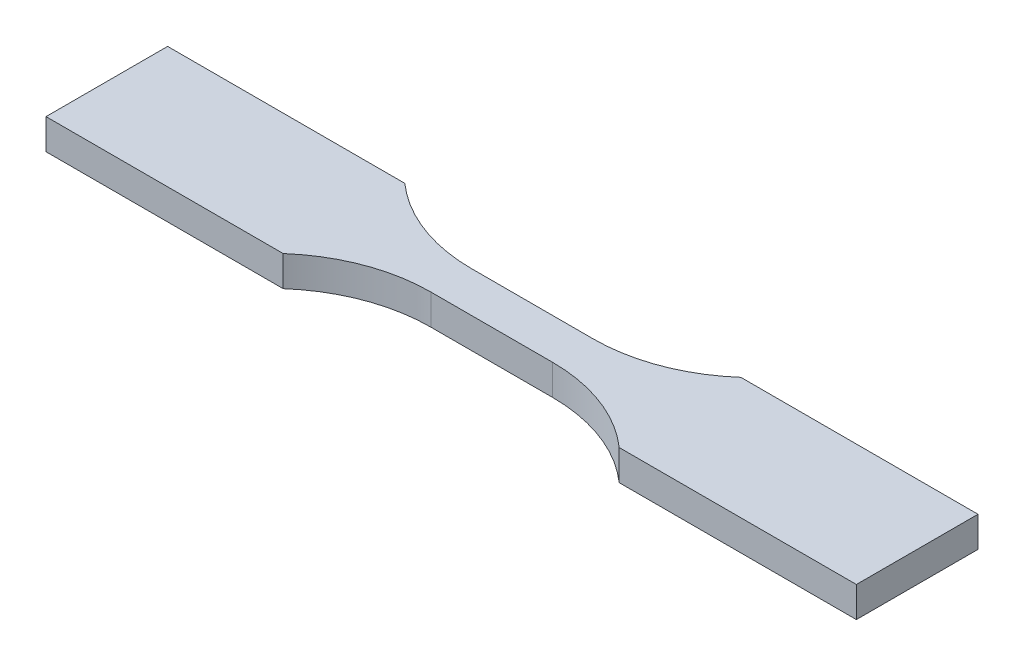
ISO-10303-21;
HEADER;
FILE_DESCRIPTION(('STEP AP214'),'2;1');
FILE_NAME('part.step','',(''),(''),'','','');
FILE_SCHEMA(('AUTOMOTIVE_DESIGN { 1 0 10303 214 1 1 1 1 }'));
ENDSEC;
DATA;
#1=APPLICATION_CONTEXT('core data for automotive mechanical design processes');
#2=APPLICATION_PROTOCOL_DEFINITION('international standard','automotive_design',2000,#1);
#3=PRODUCT_CONTEXT('',#1,'mechanical');
#4=PRODUCT('Part','Part','',(#3));
#5=PRODUCT_RELATED_PRODUCT_CATEGORY('part','',(#4));
#6=PRODUCT_DEFINITION_FORMATION('','',#4);
#7=PRODUCT_DEFINITION_CONTEXT('part definition',#1,'design');
#8=PRODUCT_DEFINITION('design','',#6,#7);
#9=PRODUCT_DEFINITION_SHAPE('','',#8);
#10=(LENGTH_UNIT() NAMED_UNIT(*) SI_UNIT(.MILLI.,.METRE.));
#11=(NAMED_UNIT(*) PLANE_ANGLE_UNIT() SI_UNIT($,.RADIAN.));
#12=(NAMED_UNIT(*) SI_UNIT($,.STERADIAN.) SOLID_ANGLE_UNIT());
#13=UNCERTAINTY_MEASURE_WITH_UNIT(LENGTH_MEASURE(1.E-05),#10,'distance_accuracy_value','');
#14=(GEOMETRIC_REPRESENTATION_CONTEXT(3) GLOBAL_UNCERTAINTY_ASSIGNED_CONTEXT((#13)) GLOBAL_UNIT_ASSIGNED_CONTEXT((#10,
#11,#12)) REPRESENTATION_CONTEXT('',''));
#15=CARTESIAN_POINT('',(0.,0.,0.));
#16=DIRECTION('',(0.,0.,1.));
#17=DIRECTION('',(1.,0.,0.));
#18=AXIS2_PLACEMENT_3D('',#15,#16,#17);
#19=CARTESIAN_POINT('',(9.9822,1.567422,0.));
#20=DIRECTION('',(-1.,0.,0.));
#21=DIRECTION('',(0.,0.,1.));
#22=AXIS2_PLACEMENT_3D('',#19,#20,#21);
#23=PLANE('',#22);
#24=DIRECTION('',(0.,0.,-1.));
#25=VECTOR('',#24,1.);
#26=CARTESIAN_POINT('',(9.9822,0.817578,0.));
#27=LINE('',#26,#25);
#28=CARTESIAN_POINT('',(9.9822,0.817578,1.498116));
#29=VERTEX_POINT('',#28);
#30=CARTESIAN_POINT('',(9.9822,0.817578,-1.498116));
#31=VERTEX_POINT('',#30);
#32=EDGE_CURVE('E212',#29,#31,#27,.T.);
#33=ORIENTED_EDGE('',*,*,#32,.T.);
#34=DIRECTION('',(0.,-1.,0.));
#35=VECTOR('',#34,1.);
#36=CARTESIAN_POINT('',(9.9822,1.567422,-1.498116));
#37=LINE('',#36,#35);
#38=CARTESIAN_POINT('',(9.9822,1.567422,-1.498116));
#39=VERTEX_POINT('',#38);
#40=EDGE_CURVE('E11',#39,#31,#37,.T.);
#41=ORIENTED_EDGE('',*,*,#40,.F.);
#42=DIRECTION('',(0.,0.,-1.));
#43=VECTOR('',#42,1.);
#44=CARTESIAN_POINT('',(9.9822,1.567422,0.));
#45=LINE('',#44,#43);
#46=CARTESIAN_POINT('',(9.9822,1.567422,1.498116));
#47=VERTEX_POINT('',#46);
#48=EDGE_CURVE('E79',#47,#39,#45,.T.);
#49=ORIENTED_EDGE('',*,*,#48,.F.);
#50=DIRECTION('',(0.,-1.,0.));
#51=VECTOR('',#50,1.);
#52=CARTESIAN_POINT('',(9.9822,1.567422,1.498116));
#53=LINE('',#52,#51);
#54=EDGE_CURVE('E199',#47,#29,#53,.T.);
#55=ORIENTED_EDGE('',*,*,#54,.T.);
#56=EDGE_LOOP('',(#33,#41,#49,#55));
#57=FACE_BOUND('',#56,.T.);
#58=ADVANCED_FACE('F39',(#57),#23,.F.);
#59=CARTESIAN_POINT('',(4.1391578737309,1.567422,-1.498116));
#60=DIRECTION('',(0.,0.,1.));
#61=DIRECTION('',(1.,0.,0.));
#62=AXIS2_PLACEMENT_3D('',#59,#60,#61);
#63=PLANE('',#62);
#64=DIRECTION('',(-1.,0.,0.));
#65=VECTOR('',#64,1.);
#66=CARTESIAN_POINT('',(4.1391578737309,0.817578,-1.498116));
#67=LINE('',#66,#65);
#68=CARTESIAN_POINT('',(4.1391578737309,0.817578,-1.498116));
#69=VERTEX_POINT('',#68);
#70=EDGE_CURVE('E69',#31,#69,#67,.T.);
#71=ORIENTED_EDGE('',*,*,#70,.T.);
#72=DIRECTION('',(0.,-1.,0.));
#73=VECTOR('',#72,1.);
#74=CARTESIAN_POINT('',(4.1391578737309,1.567422,-1.498116));
#75=LINE('',#74,#73);
#76=CARTESIAN_POINT('',(4.1391578737309,1.567422,-1.498116));
#77=VERTEX_POINT('',#76);
#78=EDGE_CURVE('E47',#77,#69,#75,.T.);
#79=ORIENTED_EDGE('',*,*,#78,.F.);
#80=DIRECTION('',(-1.,0.,0.));
#81=VECTOR('',#80,1.);
#82=CARTESIAN_POINT('',(4.1391578737309,1.567422,-1.498116));
#83=LINE('',#82,#81);
#84=EDGE_CURVE('E214',#39,#77,#83,.T.);
#85=ORIENTED_EDGE('',*,*,#84,.F.);
#86=ORIENTED_EDGE('',*,*,#40,.T.);
#87=EDGE_LOOP('',(#71,#79,#85,#86));
#88=FACE_BOUND('',#87,.T.);
#89=ADVANCED_FACE('F256',(#88),#63,.F.);
#90=CARTESIAN_POINT('',(1.498116,1.567422,-4.492776));
#91=DIRECTION('',(0.,-1.,0.));
#92=DIRECTION('',(0.,0.,-1.));
#93=AXIS2_PLACEMENT_3D('',#90,#91,#92);
#94=CYLINDRICAL_SURFACE('',#93,3.99288);
#95=CARTESIAN_POINT('',(1.498116,0.817578,-4.492776));
#96=DIRECTION('',(0.,-1.,0.));
#97=DIRECTION('',(0.,0.,1.));
#98=AXIS2_PLACEMENT_3D('',#95,#96,#97);
#99=CIRCLE('',#98,3.99288);
#100=CARTESIAN_POINT('',(1.498116,0.817578,-0.499896));
#101=VERTEX_POINT('',#100);
#102=EDGE_CURVE('E74',#69,#101,#99,.T.);
#103=ORIENTED_EDGE('',*,*,#102,.T.);
#104=DIRECTION('',(0.,-1.,0.));
#105=VECTOR('',#104,1.);
#106=CARTESIAN_POINT('',(1.498116,1.567422,-0.499896));
#107=LINE('',#106,#105);
#108=CARTESIAN_POINT('',(1.498116,1.567422,-0.499896));
#109=VERTEX_POINT('',#108);
#110=EDGE_CURVE('E220',#109,#101,#107,.T.);
#111=ORIENTED_EDGE('',*,*,#110,.F.);
#112=CARTESIAN_POINT('',(1.498116,1.567422,-4.492776));
#113=DIRECTION('',(0.,-1.,0.));
#114=DIRECTION('',(0.,0.,1.));
#115=AXIS2_PLACEMENT_3D('',#112,#113,#114);
#116=CIRCLE('',#115,3.99288);
#117=EDGE_CURVE('E55',#77,#109,#116,.T.);
#118=ORIENTED_EDGE('',*,*,#117,.F.);
#119=ORIENTED_EDGE('',*,*,#78,.T.);
#120=EDGE_LOOP('',(#103,#111,#118,#119));
#121=FACE_BOUND('',#120,.T.);
#122=ADVANCED_FACE('F225',(#121),#94,.F.);
#123=CARTESIAN_POINT('',(0.,1.567422,-0.499896));
#124=DIRECTION('',(0.,0.,1.));
#125=DIRECTION('',(1.,0.,0.));
#126=AXIS2_PLACEMENT_3D('',#123,#124,#125);
#127=PLANE('',#126);
#128=DIRECTION('',(-1.,0.,0.));
#129=VECTOR('',#128,1.);
#130=CARTESIAN_POINT('',(0.,0.817578,-0.499896));
#131=LINE('',#130,#129);
#132=CARTESIAN_POINT('',(-1.498116,0.817578,-0.499896));
#133=VERTEX_POINT('',#132);
#134=EDGE_CURVE('E215',#101,#133,#131,.T.);
#135=ORIENTED_EDGE('',*,*,#134,.T.);
#136=DIRECTION('',(0.,-1.,0.));
#137=VECTOR('',#136,1.);
#138=CARTESIAN_POINT('',(-1.498116,1.567422,-0.499896));
#139=LINE('',#138,#137);
#140=CARTESIAN_POINT('',(-1.498116,1.567422,-0.499896));
#141=VERTEX_POINT('',#140);
#142=EDGE_CURVE('E186',#141,#133,#139,.T.);
#143=ORIENTED_EDGE('',*,*,#142,.F.);
#144=DIRECTION('',(-1.,0.,0.));
#145=VECTOR('',#144,1.);
#146=CARTESIAN_POINT('',(0.,1.567422,-0.499896));
#147=LINE('',#146,#145);
#148=EDGE_CURVE('E218',#109,#141,#147,.T.);
#149=ORIENTED_EDGE('',*,*,#148,.F.);
#150=ORIENTED_EDGE('',*,*,#110,.T.);
#151=EDGE_LOOP('',(#135,#143,#149,#150));
#152=FACE_BOUND('',#151,.T.);
#153=ADVANCED_FACE('F233',(#152),#127,.F.);
#154=CARTESIAN_POINT('',(1.498116,1.567422,-4.492776));
#155=DIRECTION('',(0.,1.,0.));
#156=DIRECTION('',(0.,0.,1.));
#157=AXIS2_PLACEMENT_3D('',#154,#155,#156);
#158=PLANE('',#157);
#159=CARTESIAN_POINT('',(-1.498116,1.567422,4.492776));
#160=DIRECTION('',(0.,-1.,0.));
#161=DIRECTION('',(0.,0.,-1.));
#162=AXIS2_PLACEMENT_3D('',#159,#160,#161);
#163=CIRCLE('',#162,3.99288);
#164=CARTESIAN_POINT('',(-4.1391578737309,1.567422,1.498116));
#165=VERTEX_POINT('',#164);
#166=CARTESIAN_POINT('',(-1.498116,1.567422,0.499896));
#167=VERTEX_POINT('',#166);
#168=EDGE_CURVE('E160',#165,#167,#163,.T.);
#169=ORIENTED_EDGE('',*,*,#168,.T.);
#170=DIRECTION('',(-1.,0.,0.));
#171=VECTOR('',#170,1.);
#172=CARTESIAN_POINT('',(0.,1.567422,0.499896));
#173=LINE('',#172,#171);
#174=CARTESIAN_POINT('',(1.498116,1.567422,0.499896));
#175=VERTEX_POINT('',#174);
#176=EDGE_CURVE('E190',#175,#167,#173,.T.);
#177=ORIENTED_EDGE('',*,*,#176,.F.);
#178=CARTESIAN_POINT('',(1.498116,1.567422,4.492776));
#179=DIRECTION('',(0.,1.,0.));
#180=DIRECTION('',(0.,0.,-1.));
#181=AXIS2_PLACEMENT_3D('',#178,#179,#180);
#182=CIRCLE('',#181,3.99288);
#183=CARTESIAN_POINT('',(4.1391578737309,1.567422,1.498116));
#184=VERTEX_POINT('',#183);
#185=EDGE_CURVE('E192',#184,#175,#182,.T.);
#186=ORIENTED_EDGE('',*,*,#185,.F.);
#187=DIRECTION('',(-1.,0.,0.));
#188=VECTOR('',#187,1.);
#189=CARTESIAN_POINT('',(4.1391578737309,1.567422,1.498116));
#190=LINE('',#189,#188);
#191=EDGE_CURVE('E196',#47,#184,#190,.T.);
#192=ORIENTED_EDGE('',*,*,#191,.F.);
#193=ORIENTED_EDGE('',*,*,#48,.T.);
#194=ORIENTED_EDGE('',*,*,#84,.T.);
#195=ORIENTED_EDGE('',*,*,#117,.T.);
#196=ORIENTED_EDGE('',*,*,#148,.T.);
#197=CARTESIAN_POINT('',(-1.498116,1.567422,-4.492776));
#198=DIRECTION('',(0.,1.,0.));
#199=DIRECTION('',(0.,0.,1.));
#200=AXIS2_PLACEMENT_3D('',#197,#198,#199);
#201=CIRCLE('',#200,3.99288);
#202=CARTESIAN_POINT('',(-4.1391578737309,1.567422,-1.498116));
#203=VERTEX_POINT('',#202);
#204=EDGE_CURVE('E173',#203,#141,#201,.T.);
#205=ORIENTED_EDGE('',*,*,#204,.F.);
#206=DIRECTION('',(1.,0.,0.));
#207=VECTOR('',#206,1.);
#208=CARTESIAN_POINT('',(-4.1391578737309,1.567422,-1.498116));
#209=LINE('',#208,#207);
#210=CARTESIAN_POINT('',(-9.9822,1.567422,-1.498116));
#211=VERTEX_POINT('',#210);
#212=EDGE_CURVE('E143',#211,#203,#209,.T.);
#213=ORIENTED_EDGE('',*,*,#212,.F.);
#214=DIRECTION('',(0.,0.,-1.));
#215=VECTOR('',#214,1.);
#216=CARTESIAN_POINT('',(-9.9822,1.567422,0.));
#217=LINE('',#216,#215);
#218=CARTESIAN_POINT('',(-9.9822,1.567422,1.498116));
#219=VERTEX_POINT('',#218);
#220=EDGE_CURVE('E134',#219,#211,#217,.T.);
#221=ORIENTED_EDGE('',*,*,#220,.F.);
#222=DIRECTION('',(1.,0.,0.));
#223=VECTOR('',#222,1.);
#224=CARTESIAN_POINT('',(-4.1391578737309,1.567422,1.498116));
#225=LINE('',#224,#223);
#226=EDGE_CURVE('E139',#219,#165,#225,.T.);
#227=ORIENTED_EDGE('',*,*,#226,.T.);
#228=EDGE_LOOP('',(#169,#177,#186,#192,#193,#194,#195,#196,#205,#213,#221,#227));
#229=FACE_BOUND('',#228,.T.);
#230=ADVANCED_FACE('F137',(#229),#158,.T.);
#231=CARTESIAN_POINT('',(1.498116,0.817578,-4.492776));
#232=DIRECTION('',(0.,1.,0.));
#233=DIRECTION('',(0.,0.,1.));
#234=AXIS2_PLACEMENT_3D('',#231,#232,#233);
#235=PLANE('',#234);
#236=DIRECTION('',(-1.,0.,0.));
#237=VECTOR('',#236,1.);
#238=CARTESIAN_POINT('',(0.,0.817578,0.499896));
#239=LINE('',#238,#237);
#240=CARTESIAN_POINT('',(1.498116,0.817578,0.499896));
#241=VERTEX_POINT('',#240);
#242=CARTESIAN_POINT('',(-1.498116,0.817578,0.499896));
#243=VERTEX_POINT('',#242);
#244=EDGE_CURVE('E189',#241,#243,#239,.T.);
#245=ORIENTED_EDGE('',*,*,#244,.T.);
#246=CARTESIAN_POINT('',(-1.498116,0.817578,4.492776));
#247=DIRECTION('',(0.,-1.,0.));
#248=DIRECTION('',(0.,0.,-1.));
#249=AXIS2_PLACEMENT_3D('',#246,#247,#248);
#250=CIRCLE('',#249,3.99288);
#251=CARTESIAN_POINT('',(-4.1391578737309,0.817578,1.498116));
#252=VERTEX_POINT('',#251);
#253=EDGE_CURVE('E161',#252,#243,#250,.T.);
#254=ORIENTED_EDGE('',*,*,#253,.F.);
#255=DIRECTION('',(1.,0.,0.));
#256=VECTOR('',#255,1.);
#257=CARTESIAN_POINT('',(-4.1391578737309,0.817578,1.498116));
#258=LINE('',#257,#256);
#259=CARTESIAN_POINT('',(-9.9822,0.817578,1.498116));
#260=VERTEX_POINT('',#259);
#261=EDGE_CURVE('E166',#260,#252,#258,.T.);
#262=ORIENTED_EDGE('',*,*,#261,.F.);
#263=DIRECTION('',(0.,0.,-1.));
#264=VECTOR('',#263,1.);
#265=CARTESIAN_POINT('',(-9.9822,0.817578,0.));
#266=LINE('',#265,#264);
#267=CARTESIAN_POINT('',(-9.9822,0.817578,-1.498116));
#268=VERTEX_POINT('',#267);
#269=EDGE_CURVE('E151',#260,#268,#266,.T.);
#270=ORIENTED_EDGE('',*,*,#269,.T.);
#271=DIRECTION('',(1.,0.,0.));
#272=VECTOR('',#271,1.);
#273=CARTESIAN_POINT('',(-4.1391578737309,0.817578,-1.498116));
#274=LINE('',#273,#272);
#275=CARTESIAN_POINT('',(-4.1391578737309,0.817578,-1.498116));
#276=VERTEX_POINT('',#275);
#277=EDGE_CURVE('E179',#268,#276,#274,.T.);
#278=ORIENTED_EDGE('',*,*,#277,.T.);
#279=CARTESIAN_POINT('',(-1.498116,0.817578,-4.492776));
#280=DIRECTION('',(0.,1.,0.));
#281=DIRECTION('',(0.,0.,1.));
#282=AXIS2_PLACEMENT_3D('',#279,#280,#281);
#283=CIRCLE('',#282,3.99288);
#284=EDGE_CURVE('E154',#276,#133,#283,.T.);
#285=ORIENTED_EDGE('',*,*,#284,.T.);
#286=ORIENTED_EDGE('',*,*,#134,.F.);
#287=ORIENTED_EDGE('',*,*,#102,.F.);
#288=ORIENTED_EDGE('',*,*,#70,.F.);
#289=ORIENTED_EDGE('',*,*,#32,.F.);
#290=DIRECTION('',(-1.,0.,0.));
#291=VECTOR('',#290,1.);
#292=CARTESIAN_POINT('',(4.1391578737309,0.817578,1.498116));
#293=LINE('',#292,#291);
#294=CARTESIAN_POINT('',(4.1391578737309,0.817578,1.498116));
#295=VERTEX_POINT('',#294);
#296=EDGE_CURVE('E193',#29,#295,#293,.T.);
#297=ORIENTED_EDGE('',*,*,#296,.T.);
#298=CARTESIAN_POINT('',(1.498116,0.817578,4.492776));
#299=DIRECTION('',(0.,1.,0.));
#300=DIRECTION('',(0.,0.,-1.));
#301=AXIS2_PLACEMENT_3D('',#298,#299,#300);
#302=CIRCLE('',#301,3.99288);
#303=EDGE_CURVE('E201',#295,#241,#302,.T.);
#304=ORIENTED_EDGE('',*,*,#303,.T.);
#305=EDGE_LOOP('',(#245,#254,#262,#270,#278,#285,#286,#287,#288,#289,#297,#304));
#306=FACE_BOUND('',#305,.T.);
#307=ADVANCED_FACE('F229',(#306),#235,.F.);
#308=CARTESIAN_POINT('',(0.,1.567422,0.499896));
#309=DIRECTION('',(0.,0.,1.));
#310=DIRECTION('',(1.,0.,0.));
#311=AXIS2_PLACEMENT_3D('',#308,#309,#310);
#312=PLANE('',#311);
#313=ORIENTED_EDGE('',*,*,#244,.F.);
#314=DIRECTION('',(0.,-1.,0.));
#315=VECTOR('',#314,1.);
#316=CARTESIAN_POINT('',(1.498116,1.567422,0.499896));
#317=LINE('',#316,#315);
#318=EDGE_CURVE('E210',#175,#241,#317,.T.);
#319=ORIENTED_EDGE('',*,*,#318,.F.);
#320=ORIENTED_EDGE('',*,*,#176,.T.);
#321=DIRECTION('',(0.,-1.,0.));
#322=VECTOR('',#321,1.);
#323=CARTESIAN_POINT('',(-1.498116,1.567422,0.499896));
#324=LINE('',#323,#322);
#325=EDGE_CURVE('E163',#167,#243,#324,.T.);
#326=ORIENTED_EDGE('',*,*,#325,.T.);
#327=EDGE_LOOP('',(#313,#319,#320,#326));
#328=FACE_BOUND('',#327,.T.);
#329=ADVANCED_FACE('F268',(#328),#312,.T.);
#330=CARTESIAN_POINT('',(1.498116,1.567422,4.492776));
#331=DIRECTION('',(0.,-1.,0.));
#332=DIRECTION('',(0.,0.,-1.));
#333=AXIS2_PLACEMENT_3D('',#330,#331,#332);
#334=CYLINDRICAL_SURFACE('',#333,3.99288);
#335=ORIENTED_EDGE('',*,*,#303,.F.);
#336=DIRECTION('',(0.,-1.,0.));
#337=VECTOR('',#336,1.);
#338=CARTESIAN_POINT('',(4.1391578737309,1.567422,1.498116));
#339=LINE('',#338,#337);
#340=EDGE_CURVE('E208',#184,#295,#339,.T.);
#341=ORIENTED_EDGE('',*,*,#340,.F.);
#342=ORIENTED_EDGE('',*,*,#185,.T.);
#343=ORIENTED_EDGE('',*,*,#318,.T.);
#344=EDGE_LOOP('',(#335,#341,#342,#343));
#345=FACE_BOUND('',#344,.T.);
#346=ADVANCED_FACE('F249',(#345),#334,.F.);
#347=CARTESIAN_POINT('',(4.1391578737309,1.567422,1.498116));
#348=DIRECTION('',(0.,0.,1.));
#349=DIRECTION('',(1.,0.,0.));
#350=AXIS2_PLACEMENT_3D('',#347,#348,#349);
#351=PLANE('',#350);
#352=ORIENTED_EDGE('',*,*,#296,.F.);
#353=ORIENTED_EDGE('',*,*,#54,.F.);
#354=ORIENTED_EDGE('',*,*,#191,.T.);
#355=ORIENTED_EDGE('',*,*,#340,.T.);
#356=EDGE_LOOP('',(#352,#353,#354,#355));
#357=FACE_BOUND('',#356,.T.);
#358=ADVANCED_FACE('F253',(#357),#351,.T.);
#359=CARTESIAN_POINT('',(-1.498116,1.567422,-4.492776));
#360=DIRECTION('',(0.,-1.,0.));
#361=DIRECTION('',(0.,0.,-1.));
#362=AXIS2_PLACEMENT_3D('',#359,#360,#361);
#363=CYLINDRICAL_SURFACE('',#362,3.99288);
#364=ORIENTED_EDGE('',*,*,#284,.F.);
#365=DIRECTION('',(0.,-1.,0.));
#366=VECTOR('',#365,1.);
#367=CARTESIAN_POINT('',(-4.1391578737309,1.567422,-1.498116));
#368=LINE('',#367,#366);
#369=EDGE_CURVE('E184',#203,#276,#368,.T.);
#370=ORIENTED_EDGE('',*,*,#369,.F.);
#371=ORIENTED_EDGE('',*,*,#204,.T.);
#372=ORIENTED_EDGE('',*,*,#142,.T.);
#373=EDGE_LOOP('',(#364,#370,#371,#372));
#374=FACE_BOUND('',#373,.T.);
#375=ADVANCED_FACE('F236',(#374),#363,.F.);
#376=CARTESIAN_POINT('',(-4.1391578737309,1.567422,-1.498116));
#377=DIRECTION('',(0.,0.,-1.));
#378=DIRECTION('',(-1.,0.,0.));
#379=AXIS2_PLACEMENT_3D('',#376,#377,#378);
#380=PLANE('',#379);
#381=ORIENTED_EDGE('',*,*,#277,.F.);
#382=DIRECTION('',(0.,-1.,0.));
#383=VECTOR('',#382,1.);
#384=CARTESIAN_POINT('',(-9.9822,1.567422,-1.498116));
#385=LINE('',#384,#383);
#386=EDGE_CURVE('E145',#211,#268,#385,.T.);
#387=ORIENTED_EDGE('',*,*,#386,.F.);
#388=ORIENTED_EDGE('',*,*,#212,.T.);
#389=ORIENTED_EDGE('',*,*,#369,.T.);
#390=EDGE_LOOP('',(#381,#387,#388,#389));
#391=FACE_BOUND('',#390,.T.);
#392=ADVANCED_FACE('F239',(#391),#380,.T.);
#393=CARTESIAN_POINT('',(-9.9822,1.567422,0.));
#394=DIRECTION('',(-1.,0.,0.));
#395=DIRECTION('',(0.,0.,1.));
#396=AXIS2_PLACEMENT_3D('',#393,#394,#395);
#397=PLANE('',#396);
#398=ORIENTED_EDGE('',*,*,#269,.F.);
#399=DIRECTION('',(0.,-1.,0.));
#400=VECTOR('',#399,1.);
#401=CARTESIAN_POINT('',(-9.9822,1.567422,1.498116));
#402=LINE('',#401,#400);
#403=EDGE_CURVE('E148',#219,#260,#402,.T.);
#404=ORIENTED_EDGE('',*,*,#403,.F.);
#405=ORIENTED_EDGE('',*,*,#220,.T.);
#406=ORIENTED_EDGE('',*,*,#386,.T.);
#407=EDGE_LOOP('',(#398,#404,#405,#406));
#408=FACE_BOUND('',#407,.T.);
#409=ADVANCED_FACE('F149',(#408),#397,.T.);
#410=CARTESIAN_POINT('',(-4.1391578737309,1.567422,1.498116));
#411=DIRECTION('',(0.,0.,-1.));
#412=DIRECTION('',(-1.,0.,0.));
#413=AXIS2_PLACEMENT_3D('',#410,#411,#412);
#414=PLANE('',#413);
#415=ORIENTED_EDGE('',*,*,#261,.T.);
#416=DIRECTION('',(0.,-1.,0.));
#417=VECTOR('',#416,1.);
#418=CARTESIAN_POINT('',(-4.1391578737309,1.567422,1.498116));
#419=LINE('',#418,#417);
#420=EDGE_CURVE('E155',#165,#252,#419,.T.);
#421=ORIENTED_EDGE('',*,*,#420,.F.);
#422=ORIENTED_EDGE('',*,*,#226,.F.);
#423=ORIENTED_EDGE('',*,*,#403,.T.);
#424=EDGE_LOOP('',(#415,#421,#422,#423));
#425=FACE_BOUND('',#424,.T.);
#426=ADVANCED_FACE('F157',(#425),#414,.F.);
#427=CARTESIAN_POINT('',(-1.498116,1.567422,4.492776));
#428=DIRECTION('',(0.,-1.,0.));
#429=DIRECTION('',(0.,0.,-1.));
#430=AXIS2_PLACEMENT_3D('',#427,#428,#429);
#431=CYLINDRICAL_SURFACE('',#430,3.99288);
#432=ORIENTED_EDGE('',*,*,#253,.T.);
#433=ORIENTED_EDGE('',*,*,#325,.F.);
#434=ORIENTED_EDGE('',*,*,#168,.F.);
#435=ORIENTED_EDGE('',*,*,#420,.T.);
#436=EDGE_LOOP('',(#432,#433,#434,#435));
#437=FACE_BOUND('',#436,.T.);
#438=ADVANCED_FACE('F242',(#437),#431,.F.);
#439=CLOSED_SHELL('',(#58,#89,#122,#153,#230,#307,#329,#346,#358,#375,#392,#409,#426,#438));
#440=MANIFOLD_SOLID_BREP('B2',#439);
#441=ADVANCED_BREP_SHAPE_REPRESENTATION('',(#18,#440),#14);
#442=SHAPE_DEFINITION_REPRESENTATION(#9,#441);
ENDSEC;
END-ISO-10303-21;
